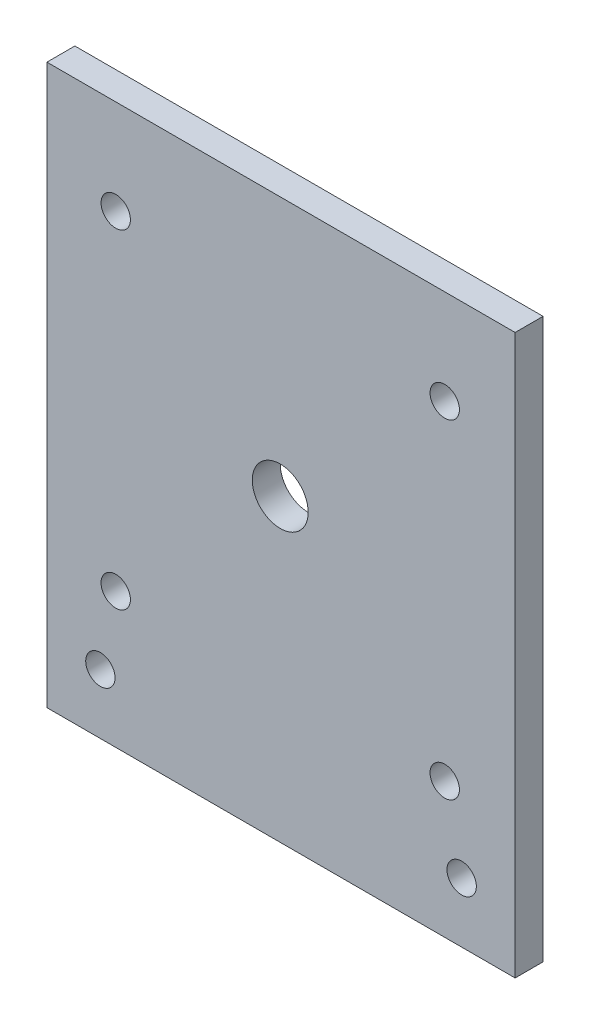
ISO-10303-21;
HEADER;
FILE_DESCRIPTION(('STEP AP214'),'2;1');
FILE_NAME('part.step','',(''),(''),'','','');
FILE_SCHEMA(('AUTOMOTIVE_DESIGN { 1 0 10303 214 1 1 1 1 }'));
ENDSEC;
DATA;
#1=APPLICATION_CONTEXT('core data for automotive mechanical design processes');
#2=APPLICATION_PROTOCOL_DEFINITION('international standard','automotive_design',2000,#1);
#3=PRODUCT_CONTEXT('',#1,'mechanical');
#4=PRODUCT('Part','Part','',(#3));
#5=PRODUCT_RELATED_PRODUCT_CATEGORY('part','',(#4));
#6=PRODUCT_DEFINITION_FORMATION('','',#4);
#7=PRODUCT_DEFINITION_CONTEXT('part definition',#1,'design');
#8=PRODUCT_DEFINITION('design','',#6,#7);
#9=PRODUCT_DEFINITION_SHAPE('','',#8);
#10=(LENGTH_UNIT() NAMED_UNIT(*) SI_UNIT(.MILLI.,.METRE.));
#11=(NAMED_UNIT(*) PLANE_ANGLE_UNIT() SI_UNIT($,.RADIAN.));
#12=(NAMED_UNIT(*) SI_UNIT($,.STERADIAN.) SOLID_ANGLE_UNIT());
#13=UNCERTAINTY_MEASURE_WITH_UNIT(LENGTH_MEASURE(1.E-05),#10,'distance_accuracy_value','');
#14=(GEOMETRIC_REPRESENTATION_CONTEXT(3) GLOBAL_UNCERTAINTY_ASSIGNED_CONTEXT((#13)) GLOBAL_UNIT_ASSIGNED_CONTEXT((#10,
#11,#12)) REPRESENTATION_CONTEXT('',''));
#15=CARTESIAN_POINT('',(0.,0.,0.));
#16=DIRECTION('',(0.,0.,1.));
#17=DIRECTION('',(1.,0.,0.));
#18=AXIS2_PLACEMENT_3D('',#15,#16,#17);
#19=CARTESIAN_POINT('',(32.5,-40.,4.));
#20=DIRECTION('',(0.,1.,0.));
#21=DIRECTION('',(-1.,0.,0.));
#22=AXIS2_PLACEMENT_3D('',#19,#20,#21);
#23=PLANE('',#22);
#24=DIRECTION('',(1.,0.,0.));
#25=VECTOR('',#24,1.);
#26=CARTESIAN_POINT('',(32.5,-40.,0.));
#27=LINE('',#26,#25);
#28=CARTESIAN_POINT('',(-33.5,-40.,0.));
#29=VERTEX_POINT('',#28);
#30=CARTESIAN_POINT('',(33.5,-40.,0.));
#31=VERTEX_POINT('',#30);
#32=EDGE_CURVE('E60',#29,#31,#27,.T.);
#33=ORIENTED_EDGE('',*,*,#32,.T.);
#34=DIRECTION('',(0.,0.,-1.));
#35=VECTOR('',#34,1.);
#36=CARTESIAN_POINT('',(33.5,-40.,4.));
#37=LINE('',#36,#35);
#38=CARTESIAN_POINT('',(33.5,-40.,4.));
#39=VERTEX_POINT('',#38);
#40=EDGE_CURVE('E74',#39,#31,#37,.T.);
#41=ORIENTED_EDGE('',*,*,#40,.F.);
#42=DIRECTION('',(1.,0.,0.));
#43=VECTOR('',#42,1.);
#44=CARTESIAN_POINT('',(32.5,-40.,4.));
#45=LINE('',#44,#43);
#46=CARTESIAN_POINT('',(-33.5,-40.,4.));
#47=VERTEX_POINT('',#46);
#48=EDGE_CURVE('E41',#47,#39,#45,.T.);
#49=ORIENTED_EDGE('',*,*,#48,.F.);
#50=DIRECTION('',(0.,0.,-1.));
#51=VECTOR('',#50,1.);
#52=CARTESIAN_POINT('',(-33.5,-40.,4.));
#53=LINE('',#52,#51);
#54=EDGE_CURVE('E77',#47,#29,#53,.T.);
#55=ORIENTED_EDGE('',*,*,#54,.T.);
#56=EDGE_LOOP('',(#33,#41,#49,#55));
#57=FACE_BOUND('',#56,.T.);
#58=ADVANCED_FACE('F32',(#57),#23,.F.);
#59=CARTESIAN_POINT('',(32.5,40.,4.));
#60=DIRECTION('',(0.,-1.,0.));
#61=DIRECTION('',(1.,0.,0.));
#62=AXIS2_PLACEMENT_3D('',#59,#60,#61);
#63=PLANE('',#62);
#64=DIRECTION('',(-1.,0.,0.));
#65=VECTOR('',#64,1.);
#66=CARTESIAN_POINT('',(32.5,40.,0.));
#67=LINE('',#66,#65);
#68=CARTESIAN_POINT('',(33.5,40.,0.));
#69=VERTEX_POINT('',#68);
#70=CARTESIAN_POINT('',(-33.5,40.,0.));
#71=VERTEX_POINT('',#70);
#72=EDGE_CURVE('E35',#69,#71,#67,.T.);
#73=ORIENTED_EDGE('',*,*,#72,.T.);
#74=DIRECTION('',(0.,0.,-1.));
#75=VECTOR('',#74,1.);
#76=CARTESIAN_POINT('',(-33.5,40.,4.));
#77=LINE('',#76,#75);
#78=CARTESIAN_POINT('',(-33.5,40.,4.));
#79=VERTEX_POINT('',#78);
#80=EDGE_CURVE('E99',#79,#71,#77,.T.);
#81=ORIENTED_EDGE('',*,*,#80,.F.);
#82=DIRECTION('',(-1.,0.,0.));
#83=VECTOR('',#82,1.);
#84=CARTESIAN_POINT('',(32.5,40.,4.));
#85=LINE('',#84,#83);
#86=CARTESIAN_POINT('',(33.5,40.,4.));
#87=VERTEX_POINT('',#86);
#88=EDGE_CURVE('E11',#87,#79,#85,.T.);
#89=ORIENTED_EDGE('',*,*,#88,.F.);
#90=DIRECTION('',(0.,0.,-1.));
#91=VECTOR('',#90,1.);
#92=CARTESIAN_POINT('',(33.5,40.,4.));
#93=LINE('',#92,#91);
#94=EDGE_CURVE('E87',#87,#69,#93,.T.);
#95=ORIENTED_EDGE('',*,*,#94,.T.);
#96=EDGE_LOOP('',(#73,#81,#89,#95));
#97=FACE_BOUND('',#96,.T.);
#98=ADVANCED_FACE('F145',(#97),#63,.F.);
#99=CARTESIAN_POINT('',(0.,0.,4.));
#100=DIRECTION('',(0.,0.,1.));
#101=DIRECTION('',(1.,0.,0.));
#102=AXIS2_PLACEMENT_3D('',#99,#100,#101);
#103=PLANE('',#102);
#104=CARTESIAN_POINT('',(-0.113382838076904,2.900000000022,4.));
#105=DIRECTION('',(0.,0.,1.));
#106=DIRECTION('',(1.,0.,0.));
#107=AXIS2_PLACEMENT_3D('',#104,#105,#106);
#108=CIRCLE('',#107,4.);
#109=CARTESIAN_POINT('',(3.8866171619231,2.900000000022,4.));
#110=VERTEX_POINT('',#109);
#111=EDGE_CURVE('E102',#110,#110,#108,.T.);
#112=ORIENTED_EDGE('',*,*,#111,.F.);
#113=EDGE_LOOP('',(#112));
#114=FACE_BOUND('',#113,.T.);
#115=CARTESIAN_POINT('',(-23.6533595329352,26.4399766948802,4.));
#116=DIRECTION('',(0.,0.,1.));
#117=DIRECTION('',(1.,0.,0.));
#118=AXIS2_PLACEMENT_3D('',#115,#116,#117);
#119=CIRCLE('',#118,2.1);
#120=CARTESIAN_POINT('',(-21.5533595329352,26.4399766948802,4.));
#121=VERTEX_POINT('',#120);
#122=EDGE_CURVE('E120',#121,#121,#119,.T.);
#123=ORIENTED_EDGE('',*,*,#122,.F.);
#124=EDGE_LOOP('',(#123));
#125=FACE_BOUND('',#124,.T.);
#126=CARTESIAN_POINT('',(23.4265938567814,26.4399766948802,4.));
#127=DIRECTION('',(0.,0.,1.));
#128=DIRECTION('',(1.,0.,0.));
#129=AXIS2_PLACEMENT_3D('',#126,#127,#128);
#130=CIRCLE('',#129,2.1);
#131=CARTESIAN_POINT('',(25.5265938567814,26.4399766948802,4.));
#132=VERTEX_POINT('',#131);
#133=EDGE_CURVE('E114',#132,#132,#130,.T.);
#134=ORIENTED_EDGE('',*,*,#133,.F.);
#135=EDGE_LOOP('',(#134));
#136=FACE_BOUND('',#135,.T.);
#137=CARTESIAN_POINT('',(23.4265938567814,-20.6399766948362,4.));
#138=DIRECTION('',(0.,0.,1.));
#139=DIRECTION('',(1.,0.,0.));
#140=AXIS2_PLACEMENT_3D('',#137,#138,#139);
#141=CIRCLE('',#140,2.1);
#142=CARTESIAN_POINT('',(25.5265938567814,-20.6399766948362,4.));
#143=VERTEX_POINT('',#142);
#144=EDGE_CURVE('E108',#143,#143,#141,.T.);
#145=ORIENTED_EDGE('',*,*,#144,.F.);
#146=EDGE_LOOP('',(#145));
#147=FACE_BOUND('',#146,.T.);
#148=CARTESIAN_POINT('',(-23.6533595329352,-20.6399766948362,4.));
#149=DIRECTION('',(0.,0.,1.));
#150=DIRECTION('',(1.,0.,0.));
#151=AXIS2_PLACEMENT_3D('',#148,#149,#150);
#152=CIRCLE('',#151,2.1);
#153=CARTESIAN_POINT('',(-21.5533595329352,-20.6399766948362,4.));
#154=VERTEX_POINT('',#153);
#155=EDGE_CURVE('E107',#154,#154,#152,.T.);
#156=ORIENTED_EDGE('',*,*,#155,.F.);
#157=EDGE_LOOP('',(#156));
#158=FACE_BOUND('',#157,.T.);
#159=CARTESIAN_POINT('',(-25.8499999999457,-31.439022519732,4.));
#160=DIRECTION('',(0.,0.,-1.));
#161=DIRECTION('',(-1.,0.,0.));
#162=AXIS2_PLACEMENT_3D('',#159,#160,#161);
#163=CIRCLE('',#162,2.1);
#164=CARTESIAN_POINT('',(-27.9499999999457,-31.439022519732,4.));
#165=VERTEX_POINT('',#164);
#166=EDGE_CURVE('E79',#165,#165,#163,.T.);
#167=ORIENTED_EDGE('',*,*,#166,.T.);
#168=EDGE_LOOP('',(#167));
#169=FACE_BOUND('',#168,.T.);
#170=CARTESIAN_POINT('',(25.8499999999456,-31.439022519732,4.));
#171=DIRECTION('',(0.,0.,-1.));
#172=DIRECTION('',(1.,0.,0.));
#173=AXIS2_PLACEMENT_3D('',#170,#171,#172);
#174=CIRCLE('',#173,2.1);
#175=CARTESIAN_POINT('',(27.9499999999456,-31.439022519732,4.));
#176=VERTEX_POINT('',#175);
#177=EDGE_CURVE('E139',#176,#176,#174,.T.);
#178=ORIENTED_EDGE('',*,*,#177,.T.);
#179=EDGE_LOOP('',(#178));
#180=FACE_BOUND('',#179,.T.);
#181=ORIENTED_EDGE('',*,*,#88,.T.);
#182=DIRECTION('',(0.,1.,0.));
#183=VECTOR('',#182,1.);
#184=CARTESIAN_POINT('',(-33.5,-40.,4.));
#185=LINE('',#184,#183);
#186=EDGE_CURVE('E95',#47,#79,#185,.T.);
#187=ORIENTED_EDGE('',*,*,#186,.F.);
#188=ORIENTED_EDGE('',*,*,#48,.T.);
#189=DIRECTION('',(0.,-1.,0.));
#190=VECTOR('',#189,1.);
#191=CARTESIAN_POINT('',(33.5,-40.,4.));
#192=LINE('',#191,#190);
#193=EDGE_CURVE('E85',#87,#39,#192,.T.);
#194=ORIENTED_EDGE('',*,*,#193,.F.);
#195=EDGE_LOOP('',(#181,#187,#188,#194));
#196=FACE_BOUND('',#195,.T.);
#197=ADVANCED_FACE('F148',(#114,#125,#136,#147,#158,#169,#180,#196),#103,.T.);
#198=CARTESIAN_POINT('',(0.,0.,0.));
#199=DIRECTION('',(0.,0.,1.));
#200=DIRECTION('',(1.,0.,0.));
#201=AXIS2_PLACEMENT_3D('',#198,#199,#200);
#202=PLANE('',#201);
#203=CARTESIAN_POINT('',(-0.113382838076904,2.900000000022,0.));
#204=DIRECTION('',(0.,0.,1.));
#205=DIRECTION('',(1.,0.,0.));
#206=AXIS2_PLACEMENT_3D('',#203,#204,#205);
#207=CIRCLE('',#206,4.);
#208=CARTESIAN_POINT('',(3.8866171619231,2.900000000022,0.));
#209=VERTEX_POINT('',#208);
#210=EDGE_CURVE('E123',#209,#209,#207,.T.);
#211=ORIENTED_EDGE('',*,*,#210,.T.);
#212=EDGE_LOOP('',(#211));
#213=FACE_BOUND('',#212,.T.);
#214=CARTESIAN_POINT('',(-23.6533595329352,26.4399766948802,0.));
#215=DIRECTION('',(0.,0.,1.));
#216=DIRECTION('',(1.,0.,0.));
#217=AXIS2_PLACEMENT_3D('',#214,#215,#216);
#218=CIRCLE('',#217,2.1);
#219=CARTESIAN_POINT('',(-21.5533595329352,26.4399766948802,0.));
#220=VERTEX_POINT('',#219);
#221=EDGE_CURVE('E117',#220,#220,#218,.T.);
#222=ORIENTED_EDGE('',*,*,#221,.T.);
#223=EDGE_LOOP('',(#222));
#224=FACE_BOUND('',#223,.T.);
#225=CARTESIAN_POINT('',(23.4265938567814,26.4399766948802,0.));
#226=DIRECTION('',(0.,0.,1.));
#227=DIRECTION('',(1.,0.,0.));
#228=AXIS2_PLACEMENT_3D('',#225,#226,#227);
#229=CIRCLE('',#228,2.1);
#230=CARTESIAN_POINT('',(25.5265938567814,26.4399766948802,0.));
#231=VERTEX_POINT('',#230);
#232=EDGE_CURVE('E111',#231,#231,#229,.T.);
#233=ORIENTED_EDGE('',*,*,#232,.T.);
#234=EDGE_LOOP('',(#233));
#235=FACE_BOUND('',#234,.T.);
#236=CARTESIAN_POINT('',(23.4265938567814,-20.6399766948362,0.));
#237=DIRECTION('',(0.,0.,1.));
#238=DIRECTION('',(1.,0.,0.));
#239=AXIS2_PLACEMENT_3D('',#236,#237,#238);
#240=CIRCLE('',#239,2.1);
#241=CARTESIAN_POINT('',(25.5265938567814,-20.6399766948362,0.));
#242=VERTEX_POINT('',#241);
#243=EDGE_CURVE('E104',#242,#242,#240,.T.);
#244=ORIENTED_EDGE('',*,*,#243,.T.);
#245=EDGE_LOOP('',(#244));
#246=FACE_BOUND('',#245,.T.);
#247=CARTESIAN_POINT('',(-23.6533595329352,-20.6399766948362,0.));
#248=DIRECTION('',(0.,0.,1.));
#249=DIRECTION('',(1.,0.,0.));
#250=AXIS2_PLACEMENT_3D('',#247,#248,#249);
#251=CIRCLE('',#250,2.1);
#252=CARTESIAN_POINT('',(-21.5533595329352,-20.6399766948362,0.));
#253=VERTEX_POINT('',#252);
#254=EDGE_CURVE('E128',#253,#253,#251,.T.);
#255=ORIENTED_EDGE('',*,*,#254,.T.);
#256=EDGE_LOOP('',(#255));
#257=FACE_BOUND('',#256,.T.);
#258=CARTESIAN_POINT('',(-25.8499999999457,-31.439022519732,0.));
#259=DIRECTION('',(0.,0.,-1.));
#260=DIRECTION('',(-1.,0.,0.));
#261=AXIS2_PLACEMENT_3D('',#258,#259,#260);
#262=CIRCLE('',#261,2.1);
#263=CARTESIAN_POINT('',(-27.9499999999457,-31.439022519732,0.));
#264=VERTEX_POINT('',#263);
#265=EDGE_CURVE('E136',#264,#264,#262,.T.);
#266=ORIENTED_EDGE('',*,*,#265,.F.);
#267=EDGE_LOOP('',(#266));
#268=FACE_BOUND('',#267,.T.);
#269=CARTESIAN_POINT('',(25.8499999999456,-31.439022519732,0.));
#270=DIRECTION('',(0.,0.,-1.));
#271=DIRECTION('',(1.,0.,0.));
#272=AXIS2_PLACEMENT_3D('',#269,#270,#271);
#273=CIRCLE('',#272,2.1);
#274=CARTESIAN_POINT('',(27.9499999999456,-31.439022519732,0.));
#275=VERTEX_POINT('',#274);
#276=EDGE_CURVE('E131',#275,#275,#273,.T.);
#277=ORIENTED_EDGE('',*,*,#276,.F.);
#278=EDGE_LOOP('',(#277));
#279=FACE_BOUND('',#278,.T.);
#280=ORIENTED_EDGE('',*,*,#32,.F.);
#281=DIRECTION('',(0.,1.,0.));
#282=VECTOR('',#281,1.);
#283=CARTESIAN_POINT('',(-33.5,-40.,0.));
#284=LINE('',#283,#282);
#285=EDGE_CURVE('E86',#29,#71,#284,.T.);
#286=ORIENTED_EDGE('',*,*,#285,.T.);
#287=ORIENTED_EDGE('',*,*,#72,.F.);
#288=DIRECTION('',(0.,-1.,0.));
#289=VECTOR('',#288,1.);
#290=CARTESIAN_POINT('',(33.5,-40.,0.));
#291=LINE('',#290,#289);
#292=EDGE_CURVE('E84',#69,#31,#291,.T.);
#293=ORIENTED_EDGE('',*,*,#292,.T.);
#294=EDGE_LOOP('',(#280,#286,#287,#293));
#295=FACE_BOUND('',#294,.T.);
#296=ADVANCED_FACE('F89',(#213,#224,#235,#246,#257,#268,#279,#295),#202,.F.);
#297=CARTESIAN_POINT('',(25.8499999999456,-31.439022519732,4.));
#298=DIRECTION('',(0.,0.,-1.));
#299=DIRECTION('',(-1.,0.,0.));
#300=AXIS2_PLACEMENT_3D('',#297,#298,#299);
#301=CYLINDRICAL_SURFACE('',#300,2.1);
#302=ORIENTED_EDGE('',*,*,#177,.F.);
#303=EDGE_LOOP('',(#302));
#304=FACE_BOUND('',#303,.T.);
#305=ORIENTED_EDGE('',*,*,#276,.T.);
#306=EDGE_LOOP('',(#305));
#307=FACE_BOUND('',#306,.T.);
#308=ADVANCED_FACE('F156',(#304,#307),#301,.F.);
#309=CARTESIAN_POINT('',(-25.8499999999457,-31.439022519732,4.));
#310=DIRECTION('',(0.,0.,-1.));
#311=DIRECTION('',(-1.,0.,0.));
#312=AXIS2_PLACEMENT_3D('',#309,#310,#311);
#313=CYLINDRICAL_SURFACE('',#312,2.1);
#314=ORIENTED_EDGE('',*,*,#166,.F.);
#315=EDGE_LOOP('',(#314));
#316=FACE_BOUND('',#315,.T.);
#317=ORIENTED_EDGE('',*,*,#265,.T.);
#318=EDGE_LOOP('',(#317));
#319=FACE_BOUND('',#318,.T.);
#320=ADVANCED_FACE('F224',(#316,#319),#313,.F.);
#321=CARTESIAN_POINT('',(-23.6533595329352,-20.6399766948362,0.));
#322=DIRECTION('',(0.,0.,1.));
#323=DIRECTION('',(1.,0.,0.));
#324=AXIS2_PLACEMENT_3D('',#321,#322,#323);
#325=CYLINDRICAL_SURFACE('',#324,2.1);
#326=ORIENTED_EDGE('',*,*,#254,.F.);
#327=EDGE_LOOP('',(#326));
#328=FACE_BOUND('',#327,.T.);
#329=ORIENTED_EDGE('',*,*,#155,.T.);
#330=EDGE_LOOP('',(#329));
#331=FACE_BOUND('',#330,.T.);
#332=ADVANCED_FACE('F211',(#328,#331),#325,.F.);
#333=CARTESIAN_POINT('',(23.4265938567814,-20.6399766948362,0.));
#334=DIRECTION('',(0.,0.,1.));
#335=DIRECTION('',(1.,0.,0.));
#336=AXIS2_PLACEMENT_3D('',#333,#334,#335);
#337=CYLINDRICAL_SURFACE('',#336,2.1);
#338=ORIENTED_EDGE('',*,*,#243,.F.);
#339=EDGE_LOOP('',(#338));
#340=FACE_BOUND('',#339,.T.);
#341=ORIENTED_EDGE('',*,*,#144,.T.);
#342=EDGE_LOOP('',(#341));
#343=FACE_BOUND('',#342,.T.);
#344=ADVANCED_FACE('F207',(#340,#343),#337,.F.);
#345=CARTESIAN_POINT('',(23.4265938567814,26.4399766948802,0.));
#346=DIRECTION('',(0.,0.,1.));
#347=DIRECTION('',(1.,0.,0.));
#348=AXIS2_PLACEMENT_3D('',#345,#346,#347);
#349=CYLINDRICAL_SURFACE('',#348,2.1);
#350=ORIENTED_EDGE('',*,*,#232,.F.);
#351=EDGE_LOOP('',(#350));
#352=FACE_BOUND('',#351,.T.);
#353=ORIENTED_EDGE('',*,*,#133,.T.);
#354=EDGE_LOOP('',(#353));
#355=FACE_BOUND('',#354,.T.);
#356=ADVANCED_FACE('F210',(#352,#355),#349,.F.);
#357=CARTESIAN_POINT('',(-23.6533595329352,26.4399766948802,0.));
#358=DIRECTION('',(0.,0.,1.));
#359=DIRECTION('',(1.,0.,0.));
#360=AXIS2_PLACEMENT_3D('',#357,#358,#359);
#361=CYLINDRICAL_SURFACE('',#360,2.1);
#362=ORIENTED_EDGE('',*,*,#221,.F.);
#363=EDGE_LOOP('',(#362));
#364=FACE_BOUND('',#363,.T.);
#365=ORIENTED_EDGE('',*,*,#122,.T.);
#366=EDGE_LOOP('',(#365));
#367=FACE_BOUND('',#366,.T.);
#368=ADVANCED_FACE('F215',(#364,#367),#361,.F.);
#369=CARTESIAN_POINT('',(-0.113382838076904,2.900000000022,0.));
#370=DIRECTION('',(0.,0.,1.));
#371=DIRECTION('',(1.,0.,0.));
#372=AXIS2_PLACEMENT_3D('',#369,#370,#371);
#373=CYLINDRICAL_SURFACE('',#372,4.);
#374=ORIENTED_EDGE('',*,*,#210,.F.);
#375=EDGE_LOOP('',(#374));
#376=FACE_BOUND('',#375,.T.);
#377=ORIENTED_EDGE('',*,*,#111,.T.);
#378=EDGE_LOOP('',(#377));
#379=FACE_BOUND('',#378,.T.);
#380=ADVANCED_FACE('F193',(#376,#379),#373,.F.);
#381=CARTESIAN_POINT('',(-33.5,-40.,4.));
#382=DIRECTION('',(-1.,0.,0.));
#383=DIRECTION('',(0.,0.,1.));
#384=AXIS2_PLACEMENT_3D('',#381,#382,#383);
#385=PLANE('',#384);
#386=ORIENTED_EDGE('',*,*,#285,.F.);
#387=ORIENTED_EDGE('',*,*,#54,.F.);
#388=ORIENTED_EDGE('',*,*,#186,.T.);
#389=ORIENTED_EDGE('',*,*,#80,.T.);
#390=EDGE_LOOP('',(#386,#387,#388,#389));
#391=FACE_BOUND('',#390,.T.);
#392=ADVANCED_FACE('F147',(#391),#385,.T.);
#393=CARTESIAN_POINT('',(33.5,-40.,4.));
#394=DIRECTION('',(1.,0.,0.));
#395=DIRECTION('',(0.,0.,-1.));
#396=AXIS2_PLACEMENT_3D('',#393,#394,#395);
#397=PLANE('',#396);
#398=ORIENTED_EDGE('',*,*,#292,.F.);
#399=ORIENTED_EDGE('',*,*,#94,.F.);
#400=ORIENTED_EDGE('',*,*,#193,.T.);
#401=ORIENTED_EDGE('',*,*,#40,.T.);
#402=EDGE_LOOP('',(#398,#399,#400,#401));
#403=FACE_BOUND('',#402,.T.);
#404=ADVANCED_FACE('F82',(#403),#397,.T.);
#405=CLOSED_SHELL('',(#58,#98,#197,#296,#308,#320,#332,#344,#356,#368,#380,#392,#404));
#406=MANIFOLD_SOLID_BREP('B2',#405);
#407=ADVANCED_BREP_SHAPE_REPRESENTATION('',(#18,#406),#14);
#408=SHAPE_DEFINITION_REPRESENTATION(#9,#407);
ENDSEC;
END-ISO-10303-21;
